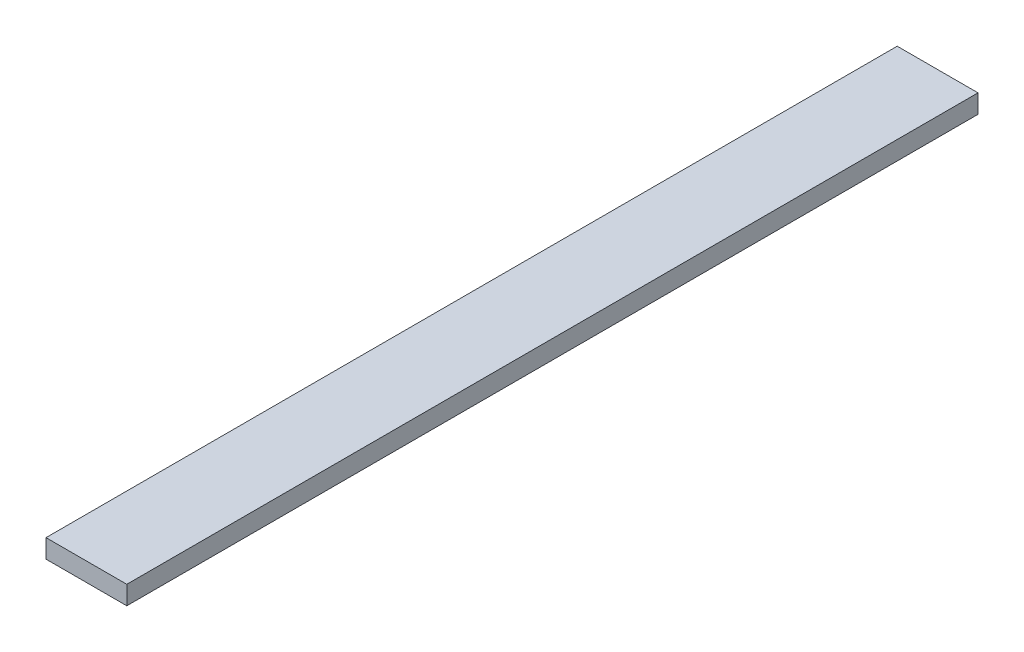
ISO-10303-21;
HEADER;
FILE_DESCRIPTION(('STEP AP214'),'2;1');
FILE_NAME('part.step','',(''),(''),'','','');
FILE_SCHEMA(('AUTOMOTIVE_DESIGN { 1 0 10303 214 1 1 1 1 }'));
ENDSEC;
DATA;
#1=APPLICATION_CONTEXT('core data for automotive mechanical design processes');
#2=APPLICATION_PROTOCOL_DEFINITION('international standard','automotive_design',2000,#1);
#3=PRODUCT_CONTEXT('',#1,'mechanical');
#4=PRODUCT('Part','Part','',(#3));
#5=PRODUCT_RELATED_PRODUCT_CATEGORY('part','',(#4));
#6=PRODUCT_DEFINITION_FORMATION('','',#4);
#7=PRODUCT_DEFINITION_CONTEXT('part definition',#1,'design');
#8=PRODUCT_DEFINITION('design','',#6,#7);
#9=PRODUCT_DEFINITION_SHAPE('','',#8);
#10=(LENGTH_UNIT() NAMED_UNIT(*) SI_UNIT(.MILLI.,.METRE.));
#11=(NAMED_UNIT(*) PLANE_ANGLE_UNIT() SI_UNIT($,.RADIAN.));
#12=(NAMED_UNIT(*) SI_UNIT($,.STERADIAN.) SOLID_ANGLE_UNIT());
#13=UNCERTAINTY_MEASURE_WITH_UNIT(LENGTH_MEASURE(1.E-05),#10,'distance_accuracy_value','');
#14=(GEOMETRIC_REPRESENTATION_CONTEXT(3) GLOBAL_UNCERTAINTY_ASSIGNED_CONTEXT((#13)) GLOBAL_UNIT_ASSIGNED_CONTEXT((#10,
#11,#12)) REPRESENTATION_CONTEXT('',''));
#15=CARTESIAN_POINT('',(0.,0.,0.));
#16=DIRECTION('',(0.,0.,1.));
#17=DIRECTION('',(1.,0.,0.));
#18=AXIS2_PLACEMENT_3D('',#15,#16,#17);
#19=CARTESIAN_POINT('',(0.,0.,434.848));
#20=DIRECTION('',(1.,0.,0.));
#21=DIRECTION('',(0.,0.,-1.));
#22=AXIS2_PLACEMENT_3D('',#19,#20,#21);
#23=PLANE('',#22);
#24=DIRECTION('',(0.,-1.,0.));
#25=VECTOR('',#24,1.);
#26=CARTESIAN_POINT('',(0.,0.,0.));
#27=LINE('',#26,#25);
#28=CARTESIAN_POINT('',(0.,9.525,0.));
#29=VERTEX_POINT('',#28);
#30=CARTESIAN_POINT('',(0.,0.,0.));
#31=VERTEX_POINT('',#30);
#32=EDGE_CURVE('E98',#29,#31,#27,.T.);
#33=ORIENTED_EDGE('',*,*,#32,.T.);
#34=DIRECTION('',(0.,0.,-1.));
#35=VECTOR('',#34,1.);
#36=CARTESIAN_POINT('',(0.,0.,434.848));
#37=LINE('',#36,#35);
#38=CARTESIAN_POINT('',(0.,0.,434.848));
#39=VERTEX_POINT('',#38);
#40=EDGE_CURVE('E11',#39,#31,#37,.T.);
#41=ORIENTED_EDGE('',*,*,#40,.F.);
#42=DIRECTION('',(0.,-1.,0.));
#43=VECTOR('',#42,1.);
#44=CARTESIAN_POINT('',(0.,0.,434.848));
#45=LINE('',#44,#43);
#46=CARTESIAN_POINT('',(0.,9.525,434.848));
#47=VERTEX_POINT('',#46);
#48=EDGE_CURVE('E86',#47,#39,#45,.T.);
#49=ORIENTED_EDGE('',*,*,#48,.F.);
#50=DIRECTION('',(0.,0.,-1.));
#51=VECTOR('',#50,1.);
#52=CARTESIAN_POINT('',(0.,9.525,434.848));
#53=LINE('',#52,#51);
#54=EDGE_CURVE('E94',#47,#29,#53,.T.);
#55=ORIENTED_EDGE('',*,*,#54,.T.);
#56=EDGE_LOOP('',(#33,#41,#49,#55));
#57=FACE_BOUND('',#56,.T.);
#58=ADVANCED_FACE('F35',(#57),#23,.F.);
#59=CARTESIAN_POINT('',(0.,0.,434.848));
#60=DIRECTION('',(0.,1.,0.));
#61=DIRECTION('',(0.,0.,1.));
#62=AXIS2_PLACEMENT_3D('',#59,#60,#61);
#63=PLANE('',#62);
#64=DIRECTION('',(1.,0.,0.));
#65=VECTOR('',#64,1.);
#66=CARTESIAN_POINT('',(0.,0.,0.));
#67=LINE('',#66,#65);
#68=CARTESIAN_POINT('',(41.275,0.,0.));
#69=VERTEX_POINT('',#68);
#70=EDGE_CURVE('E90',#31,#69,#67,.T.);
#71=ORIENTED_EDGE('',*,*,#70,.T.);
#72=DIRECTION('',(0.,0.,-1.));
#73=VECTOR('',#72,1.);
#74=CARTESIAN_POINT('',(41.275,0.,434.848));
#75=LINE('',#74,#73);
#76=CARTESIAN_POINT('',(41.275,0.,434.848));
#77=VERTEX_POINT('',#76);
#78=EDGE_CURVE('E43',#77,#69,#75,.T.);
#79=ORIENTED_EDGE('',*,*,#78,.F.);
#80=DIRECTION('',(1.,0.,0.));
#81=VECTOR('',#80,1.);
#82=CARTESIAN_POINT('',(0.,0.,434.848));
#83=LINE('',#82,#81);
#84=EDGE_CURVE('E81',#39,#77,#83,.T.);
#85=ORIENTED_EDGE('',*,*,#84,.F.);
#86=ORIENTED_EDGE('',*,*,#40,.T.);
#87=EDGE_LOOP('',(#71,#79,#85,#86));
#88=FACE_BOUND('',#87,.T.);
#89=ADVANCED_FACE('F89',(#88),#63,.F.);
#90=CARTESIAN_POINT('',(41.275,0.,434.848));
#91=DIRECTION('',(-1.,0.,0.));
#92=DIRECTION('',(0.,0.,1.));
#93=AXIS2_PLACEMENT_3D('',#90,#91,#92);
#94=PLANE('',#93);
#95=DIRECTION('',(0.,1.,0.));
#96=VECTOR('',#95,1.);
#97=CARTESIAN_POINT('',(41.275,0.,0.));
#98=LINE('',#97,#96);
#99=CARTESIAN_POINT('',(41.275,9.525,0.));
#100=VERTEX_POINT('',#99);
#101=EDGE_CURVE('E68',#69,#100,#98,.T.);
#102=ORIENTED_EDGE('',*,*,#101,.T.);
#103=DIRECTION('',(0.,0.,-1.));
#104=VECTOR('',#103,1.);
#105=CARTESIAN_POINT('',(41.275,9.525,434.848));
#106=LINE('',#105,#104);
#107=CARTESIAN_POINT('',(41.275,9.525,434.848));
#108=VERTEX_POINT('',#107);
#109=EDGE_CURVE('E91',#108,#100,#106,.T.);
#110=ORIENTED_EDGE('',*,*,#109,.F.);
#111=DIRECTION('',(0.,1.,0.));
#112=VECTOR('',#111,1.);
#113=CARTESIAN_POINT('',(41.275,0.,434.848));
#114=LINE('',#113,#112);
#115=EDGE_CURVE('E84',#77,#108,#114,.T.);
#116=ORIENTED_EDGE('',*,*,#115,.F.);
#117=ORIENTED_EDGE('',*,*,#78,.T.);
#118=EDGE_LOOP('',(#102,#110,#116,#117));
#119=FACE_BOUND('',#118,.T.);
#120=ADVANCED_FACE('F92',(#119),#94,.F.);
#121=CARTESIAN_POINT('',(0.,9.525,434.848));
#122=DIRECTION('',(0.,-1.,0.));
#123=DIRECTION('',(0.,0.,-1.));
#124=AXIS2_PLACEMENT_3D('',#121,#122,#123);
#125=PLANE('',#124);
#126=DIRECTION('',(-1.,0.,0.));
#127=VECTOR('',#126,1.);
#128=CARTESIAN_POINT('',(0.,9.525,0.));
#129=LINE('',#128,#127);
#130=EDGE_CURVE('E74',#100,#29,#129,.T.);
#131=ORIENTED_EDGE('',*,*,#130,.T.);
#132=ORIENTED_EDGE('',*,*,#54,.F.);
#133=DIRECTION('',(-1.,0.,0.));
#134=VECTOR('',#133,1.);
#135=CARTESIAN_POINT('',(0.,9.525,434.848));
#136=LINE('',#135,#134);
#137=EDGE_CURVE('E51',#108,#47,#136,.T.);
#138=ORIENTED_EDGE('',*,*,#137,.F.);
#139=ORIENTED_EDGE('',*,*,#109,.T.);
#140=EDGE_LOOP('',(#131,#132,#138,#139));
#141=FACE_BOUND('',#140,.T.);
#142=ADVANCED_FACE('F105',(#141),#125,.F.);
#143=CARTESIAN_POINT('',(0.,0.,434.848));
#144=DIRECTION('',(0.,0.,-1.));
#145=DIRECTION('',(-1.,0.,0.));
#146=AXIS2_PLACEMENT_3D('',#143,#144,#145);
#147=PLANE('',#146);
#148=ORIENTED_EDGE('',*,*,#48,.T.);
#149=ORIENTED_EDGE('',*,*,#84,.T.);
#150=ORIENTED_EDGE('',*,*,#115,.T.);
#151=ORIENTED_EDGE('',*,*,#137,.T.);
#152=EDGE_LOOP('',(#148,#149,#150,#151));
#153=FACE_BOUND('',#152,.T.);
#154=ADVANCED_FACE('F82',(#153),#147,.F.);
#155=CARTESIAN_POINT('',(0.,0.,0.));
#156=DIRECTION('',(0.,0.,-1.));
#157=DIRECTION('',(-1.,0.,0.));
#158=AXIS2_PLACEMENT_3D('',#155,#156,#157);
#159=PLANE('',#158);
#160=ORIENTED_EDGE('',*,*,#32,.F.);
#161=ORIENTED_EDGE('',*,*,#130,.F.);
#162=ORIENTED_EDGE('',*,*,#101,.F.);
#163=ORIENTED_EDGE('',*,*,#70,.F.);
#164=EDGE_LOOP('',(#160,#161,#162,#163));
#165=FACE_BOUND('',#164,.T.);
#166=ADVANCED_FACE('F108',(#165),#159,.T.);
#167=CLOSED_SHELL('',(#58,#89,#120,#142,#154,#166));
#168=MANIFOLD_SOLID_BREP('B2',#167);
#169=ADVANCED_BREP_SHAPE_REPRESENTATION('',(#18,#168),#14);
#170=SHAPE_DEFINITION_REPRESENTATION(#9,#169);
ENDSEC;
END-ISO-10303-21;
